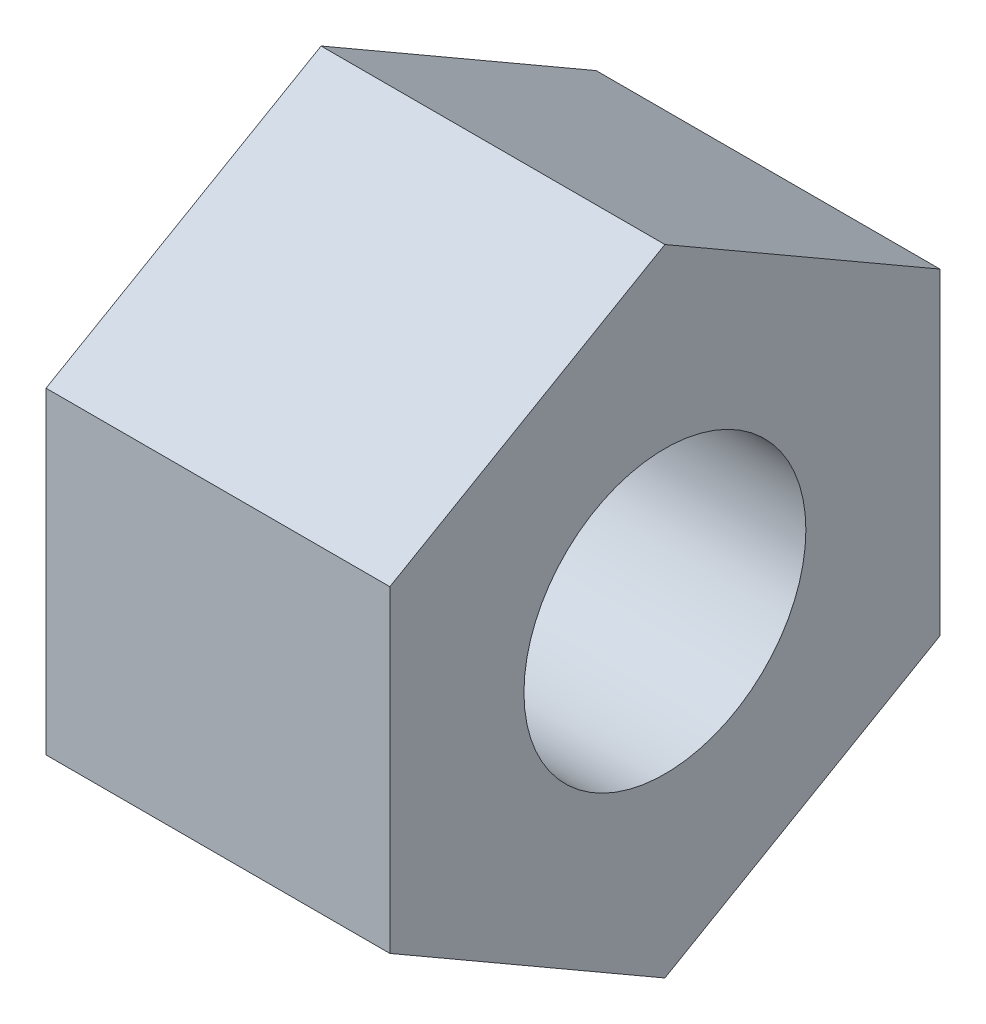
ISO-10303-21;
HEADER;
FILE_DESCRIPTION(('STEP AP214'),'2;1');
FILE_NAME('part.step','',(''),(''),'','','');
FILE_SCHEMA(('AUTOMOTIVE_DESIGN { 1 0 10303 214 1 1 1 1 }'));
ENDSEC;
DATA;
#1=APPLICATION_CONTEXT('core data for automotive mechanical design processes');
#2=APPLICATION_PROTOCOL_DEFINITION('international standard','automotive_design',2000,#1);
#3=PRODUCT_CONTEXT('',#1,'mechanical');
#4=PRODUCT('Part','Part','',(#3));
#5=PRODUCT_RELATED_PRODUCT_CATEGORY('part','',(#4));
#6=PRODUCT_DEFINITION_FORMATION('','',#4);
#7=PRODUCT_DEFINITION_CONTEXT('part definition',#1,'design');
#8=PRODUCT_DEFINITION('design','',#6,#7);
#9=PRODUCT_DEFINITION_SHAPE('','',#8);
#10=(LENGTH_UNIT() NAMED_UNIT(*) SI_UNIT(.MILLI.,.METRE.));
#11=(NAMED_UNIT(*) PLANE_ANGLE_UNIT() SI_UNIT($,.RADIAN.));
#12=(NAMED_UNIT(*) SI_UNIT($,.STERADIAN.) SOLID_ANGLE_UNIT());
#13=UNCERTAINTY_MEASURE_WITH_UNIT(LENGTH_MEASURE(1.E-05),#10,'distance_accuracy_value','');
#14=(GEOMETRIC_REPRESENTATION_CONTEXT(3) GLOBAL_UNCERTAINTY_ASSIGNED_CONTEXT((#13)) GLOBAL_UNIT_ASSIGNED_CONTEXT((#10,
#11,#12)) REPRESENTATION_CONTEXT('',''));
#15=CARTESIAN_POINT('',(0.,0.,0.));
#16=DIRECTION('',(0.,0.,1.));
#17=DIRECTION('',(1.,0.,0.));
#18=AXIS2_PLACEMENT_3D('',#15,#16,#17);
#19=CARTESIAN_POINT('',(-1.,0.,0.));
#20=DIRECTION('',(1.,0.,0.));
#21=DIRECTION('',(0.,0.,1.));
#22=AXIS2_PLACEMENT_3D('',#19,#20,#21);
#23=CYLINDRICAL_SURFACE('',#22,2.05);
#24=DIRECTION('',(1.,0.,0.));
#25=VECTOR('',#24,1.);
#26=CARTESIAN_POINT('',(-1.,0.,2.05));
#27=LINE('',#26,#25);
#28=CARTESIAN_POINT('',(0.,0.,2.05));
#29=VERTEX_POINT('',#28);
#30=CARTESIAN_POINT('',(5.,0.,2.05));
#31=VERTEX_POINT('',#30);
#32=EDGE_CURVE('E10',#29,#31,#27,.T.);
#33=ORIENTED_EDGE('',*,*,#32,.F.);
#34=CARTESIAN_POINT('',(0.,0.,0.));
#35=DIRECTION('',(1.,0.,0.));
#36=DIRECTION('',(0.,0.,1.));
#37=AXIS2_PLACEMENT_3D('',#34,#35,#36);
#38=CIRCLE('',#37,2.05);
#39=EDGE_CURVE('E160',#29,#29,#38,.T.);
#40=ORIENTED_EDGE('',*,*,#39,.F.);
#41=ORIENTED_EDGE('',*,*,#32,.T.);
#42=CARTESIAN_POINT('',(5.,0.,0.));
#43=DIRECTION('',(1.,0.,0.));
#44=DIRECTION('',(0.,0.,1.));
#45=AXIS2_PLACEMENT_3D('',#42,#43,#44);
#46=CIRCLE('',#45,2.05);
#47=EDGE_CURVE('E166',#31,#31,#46,.T.);
#48=ORIENTED_EDGE('',*,*,#47,.T.);
#49=EDGE_LOOP('',(#33,#40,#41,#48));
#50=FACE_BOUND('',#49,.T.);
#51=ADVANCED_FACE('F16',(#50),#23,.F.);
#52=CARTESIAN_POINT('',(0.,-4.618802153517,0.));
#53=DIRECTION('',(0.,0.866025403784329,0.50000000000019));
#54=DIRECTION('',(1.,0.,0.));
#55=AXIS2_PLACEMENT_3D('',#52,#53,#54);
#56=PLANE('',#55);
#57=DIRECTION('',(0.,0.50000000000019,-0.866025403784329));
#58=VECTOR('',#57,1.);
#59=CARTESIAN_POINT('',(0.,-4.618802153517,0.));
#60=LINE('',#59,#58);
#61=CARTESIAN_POINT('',(0.,-4.618802153517,0.));
#62=VERTEX_POINT('',#61);
#63=CARTESIAN_POINT('',(0.,-2.309401076759,-4.));
#64=VERTEX_POINT('',#63);
#65=EDGE_CURVE('E161',#62,#64,#60,.T.);
#66=ORIENTED_EDGE('',*,*,#65,.T.);
#67=DIRECTION('',(1.,0.,0.));
#68=VECTOR('',#67,1.);
#69=CARTESIAN_POINT('',(0.,-2.309401076759,-4.));
#70=LINE('',#69,#68);
#71=CARTESIAN_POINT('',(5.,-2.309401076759,-4.));
#72=VERTEX_POINT('',#71);
#73=EDGE_CURVE('E92',#64,#72,#70,.T.);
#74=ORIENTED_EDGE('',*,*,#73,.T.);
#75=DIRECTION('',(0.,0.50000000000019,-0.866025403784329));
#76=VECTOR('',#75,1.);
#77=CARTESIAN_POINT('',(5.,-4.618802153517,0.));
#78=LINE('',#77,#76);
#79=CARTESIAN_POINT('',(5.,-4.618802153517,0.));
#80=VERTEX_POINT('',#79);
#81=EDGE_CURVE('E167',#80,#72,#78,.T.);
#82=ORIENTED_EDGE('',*,*,#81,.F.);
#83=DIRECTION('',(1.,0.,0.));
#84=VECTOR('',#83,1.);
#85=CARTESIAN_POINT('',(0.,-4.618802153517,0.));
#86=LINE('',#85,#84);
#87=EDGE_CURVE('E25',#62,#80,#86,.T.);
#88=ORIENTED_EDGE('',*,*,#87,.F.);
#89=EDGE_LOOP('',(#66,#74,#82,#88));
#90=FACE_BOUND('',#89,.T.);
#91=ADVANCED_FACE('F186',(#90),#56,.F.);
#92=CARTESIAN_POINT('',(0.,-2.309401076759,4.));
#93=DIRECTION('',(0.,0.866025403784329,-0.50000000000019));
#94=DIRECTION('',(-1.,0.,0.));
#95=AXIS2_PLACEMENT_3D('',#92,#93,#94);
#96=PLANE('',#95);
#97=DIRECTION('',(0.,-0.50000000000019,-0.866025403784329));
#98=VECTOR('',#97,1.);
#99=CARTESIAN_POINT('',(0.,-2.309401076759,4.));
#100=LINE('',#99,#98);
#101=CARTESIAN_POINT('',(0.,-2.309401076759,4.));
#102=VERTEX_POINT('',#101);
#103=EDGE_CURVE('E157',#102,#62,#100,.T.);
#104=ORIENTED_EDGE('',*,*,#103,.T.);
#105=ORIENTED_EDGE('',*,*,#87,.T.);
#106=DIRECTION('',(0.,-0.50000000000019,-0.866025403784329));
#107=VECTOR('',#106,1.);
#108=CARTESIAN_POINT('',(5.,-2.309401076759,4.));
#109=LINE('',#108,#107);
#110=CARTESIAN_POINT('',(5.,-2.309401076759,4.));
#111=VERTEX_POINT('',#110);
#112=EDGE_CURVE('E87',#111,#80,#109,.T.);
#113=ORIENTED_EDGE('',*,*,#112,.F.);
#114=DIRECTION('',(1.,0.,0.));
#115=VECTOR('',#114,1.);
#116=CARTESIAN_POINT('',(0.,-2.309401076759,4.));
#117=LINE('',#116,#115);
#118=EDGE_CURVE('E150',#102,#111,#117,.T.);
#119=ORIENTED_EDGE('',*,*,#118,.F.);
#120=EDGE_LOOP('',(#104,#105,#113,#119));
#121=FACE_BOUND('',#120,.T.);
#122=ADVANCED_FACE('F184',(#121),#96,.F.);
#123=CARTESIAN_POINT('',(0.,-2.309401076759,-4.));
#124=DIRECTION('',(0.,0.,1.));
#125=DIRECTION('',(0.,-1.,0.));
#126=AXIS2_PLACEMENT_3D('',#123,#124,#125);
#127=PLANE('',#126);
#128=DIRECTION('',(0.,1.,0.));
#129=VECTOR('',#128,1.);
#130=CARTESIAN_POINT('',(0.,-2.309401076759,-4.));
#131=LINE('',#130,#129);
#132=CARTESIAN_POINT('',(0.,2.309401076758,-4.));
#133=VERTEX_POINT('',#132);
#134=EDGE_CURVE('E66',#64,#133,#131,.T.);
#135=ORIENTED_EDGE('',*,*,#134,.T.);
#136=DIRECTION('',(1.,0.,0.));
#137=VECTOR('',#136,1.);
#138=CARTESIAN_POINT('',(0.,2.309401076758,-4.));
#139=LINE('',#138,#137);
#140=CARTESIAN_POINT('',(5.,2.309401076758,-4.));
#141=VERTEX_POINT('',#140);
#142=EDGE_CURVE('E121',#133,#141,#139,.T.);
#143=ORIENTED_EDGE('',*,*,#142,.T.);
#144=DIRECTION('',(0.,1.,0.));
#145=VECTOR('',#144,1.);
#146=CARTESIAN_POINT('',(5.,-2.309401076759,-4.));
#147=LINE('',#146,#145);
#148=EDGE_CURVE('E53',#72,#141,#147,.T.);
#149=ORIENTED_EDGE('',*,*,#148,.F.);
#150=ORIENTED_EDGE('',*,*,#73,.F.);
#151=EDGE_LOOP('',(#135,#143,#149,#150));
#152=FACE_BOUND('',#151,.T.);
#153=ADVANCED_FACE('F210',(#152),#127,.F.);
#154=CARTESIAN_POINT('',(5.,0.,0.));
#155=DIRECTION('',(1.,0.,0.));
#156=DIRECTION('',(0.,1.,0.));
#157=AXIS2_PLACEMENT_3D('',#154,#155,#156);
#158=PLANE('',#157);
#159=ORIENTED_EDGE('',*,*,#47,.F.);
#160=EDGE_LOOP('',(#159));
#161=FACE_BOUND('',#160,.T.);
#162=DIRECTION('',(0.,-0.50000000000019,0.866025403784329));
#163=VECTOR('',#162,1.);
#164=CARTESIAN_POINT('',(5.,4.618802153517,0.));
#165=LINE('',#164,#163);
#166=CARTESIAN_POINT('',(5.,4.618802153517,0.));
#167=VERTEX_POINT('',#166);
#168=CARTESIAN_POINT('',(5.,2.309401076759,4.));
#169=VERTEX_POINT('',#168);
#170=EDGE_CURVE('E131',#167,#169,#165,.T.);
#171=ORIENTED_EDGE('',*,*,#170,.T.);
#172=DIRECTION('',(0.,-1.,0.));
#173=VECTOR('',#172,1.);
#174=CARTESIAN_POINT('',(5.,2.309401076759,4.));
#175=LINE('',#174,#173);
#176=EDGE_CURVE('E156',#169,#111,#175,.T.);
#177=ORIENTED_EDGE('',*,*,#176,.T.);
#178=ORIENTED_EDGE('',*,*,#112,.T.);
#179=ORIENTED_EDGE('',*,*,#81,.T.);
#180=ORIENTED_EDGE('',*,*,#148,.T.);
#181=DIRECTION('',(0.,0.50000000000019,0.866025403784329));
#182=VECTOR('',#181,1.);
#183=CARTESIAN_POINT('',(5.,2.309401076758,-4.));
#184=LINE('',#183,#182);
#185=EDGE_CURVE('E75',#141,#167,#184,.T.);
#186=ORIENTED_EDGE('',*,*,#185,.T.);
#187=EDGE_LOOP('',(#171,#177,#178,#179,#180,#186));
#188=FACE_BOUND('',#187,.T.);
#189=ADVANCED_FACE('F187',(#161,#188),#158,.T.);
#190=CARTESIAN_POINT('',(0.,0.,0.));
#191=DIRECTION('',(1.,0.,0.));
#192=DIRECTION('',(0.,1.,0.));
#193=AXIS2_PLACEMENT_3D('',#190,#191,#192);
#194=PLANE('',#193);
#195=ORIENTED_EDGE('',*,*,#39,.T.);
#196=EDGE_LOOP('',(#195));
#197=FACE_BOUND('',#196,.T.);
#198=DIRECTION('',(0.,0.50000000000019,0.866025403784329));
#199=VECTOR('',#198,1.);
#200=CARTESIAN_POINT('',(0.,2.309401076758,-4.));
#201=LINE('',#200,#199);
#202=CARTESIAN_POINT('',(0.,4.618802153517,0.));
#203=VERTEX_POINT('',#202);
#204=EDGE_CURVE('E116',#133,#203,#201,.T.);
#205=ORIENTED_EDGE('',*,*,#204,.F.);
#206=ORIENTED_EDGE('',*,*,#134,.F.);
#207=ORIENTED_EDGE('',*,*,#65,.F.);
#208=ORIENTED_EDGE('',*,*,#103,.F.);
#209=DIRECTION('',(0.,-1.,0.));
#210=VECTOR('',#209,1.);
#211=CARTESIAN_POINT('',(0.,2.309401076759,4.));
#212=LINE('',#211,#210);
#213=CARTESIAN_POINT('',(0.,2.309401076759,4.));
#214=VERTEX_POINT('',#213);
#215=EDGE_CURVE('E136',#214,#102,#212,.T.);
#216=ORIENTED_EDGE('',*,*,#215,.F.);
#217=DIRECTION('',(0.,-0.50000000000019,0.866025403784329));
#218=VECTOR('',#217,1.);
#219=CARTESIAN_POINT('',(0.,4.618802153517,0.));
#220=LINE('',#219,#218);
#221=EDGE_CURVE('E130',#203,#214,#220,.T.);
#222=ORIENTED_EDGE('',*,*,#221,.F.);
#223=EDGE_LOOP('',(#205,#206,#207,#208,#216,#222));
#224=FACE_BOUND('',#223,.T.);
#225=ADVANCED_FACE('F134',(#197,#224),#194,.F.);
#226=CARTESIAN_POINT('',(0.,2.309401076759,4.));
#227=DIRECTION('',(0.,0.,-1.));
#228=DIRECTION('',(0.,-1.,0.));
#229=AXIS2_PLACEMENT_3D('',#226,#227,#228);
#230=PLANE('',#229);
#231=ORIENTED_EDGE('',*,*,#215,.T.);
#232=ORIENTED_EDGE('',*,*,#118,.T.);
#233=ORIENTED_EDGE('',*,*,#176,.F.);
#234=DIRECTION('',(1.,0.,0.));
#235=VECTOR('',#234,1.);
#236=CARTESIAN_POINT('',(0.,2.309401076759,4.));
#237=LINE('',#236,#235);
#238=EDGE_CURVE('E139',#214,#169,#237,.T.);
#239=ORIENTED_EDGE('',*,*,#238,.F.);
#240=EDGE_LOOP('',(#231,#232,#233,#239));
#241=FACE_BOUND('',#240,.T.);
#242=ADVANCED_FACE('F189',(#241),#230,.F.);
#243=CARTESIAN_POINT('',(0.,2.309401076758,-4.));
#244=DIRECTION('',(0.,-0.866025403784329,0.50000000000019));
#245=DIRECTION('',(-1.,0.,0.));
#246=AXIS2_PLACEMENT_3D('',#243,#244,#245);
#247=PLANE('',#246);
#248=ORIENTED_EDGE('',*,*,#204,.T.);
#249=DIRECTION('',(1.,0.,0.));
#250=VECTOR('',#249,1.);
#251=CARTESIAN_POINT('',(0.,4.618802153517,0.));
#252=LINE('',#251,#250);
#253=EDGE_CURVE('E119',#203,#167,#252,.T.);
#254=ORIENTED_EDGE('',*,*,#253,.T.);
#255=ORIENTED_EDGE('',*,*,#185,.F.);
#256=ORIENTED_EDGE('',*,*,#142,.F.);
#257=EDGE_LOOP('',(#248,#254,#255,#256));
#258=FACE_BOUND('',#257,.T.);
#259=ADVANCED_FACE('F118',(#258),#247,.F.);
#260=CARTESIAN_POINT('',(0.,4.618802153517,0.));
#261=DIRECTION('',(0.,-0.866025403784329,-0.50000000000019));
#262=DIRECTION('',(0.,0.50000000000019,-0.866025403784329));
#263=AXIS2_PLACEMENT_3D('',#260,#261,#262);
#264=PLANE('',#263);
#265=ORIENTED_EDGE('',*,*,#221,.T.);
#266=ORIENTED_EDGE('',*,*,#238,.T.);
#267=ORIENTED_EDGE('',*,*,#170,.F.);
#268=ORIENTED_EDGE('',*,*,#253,.F.);
#269=EDGE_LOOP('',(#265,#266,#267,#268));
#270=FACE_BOUND('',#269,.T.);
#271=ADVANCED_FACE('F128',(#270),#264,.F.);
#272=CLOSED_SHELL('',(#51,#91,#122,#153,#189,#225,#242,#259,#271));
#273=MANIFOLD_SOLID_BREP('B1',#272);
#274=ADVANCED_BREP_SHAPE_REPRESENTATION('',(#18,#273),#14);
#275=SHAPE_DEFINITION_REPRESENTATION(#9,#274);
ENDSEC;
END-ISO-10303-21;
